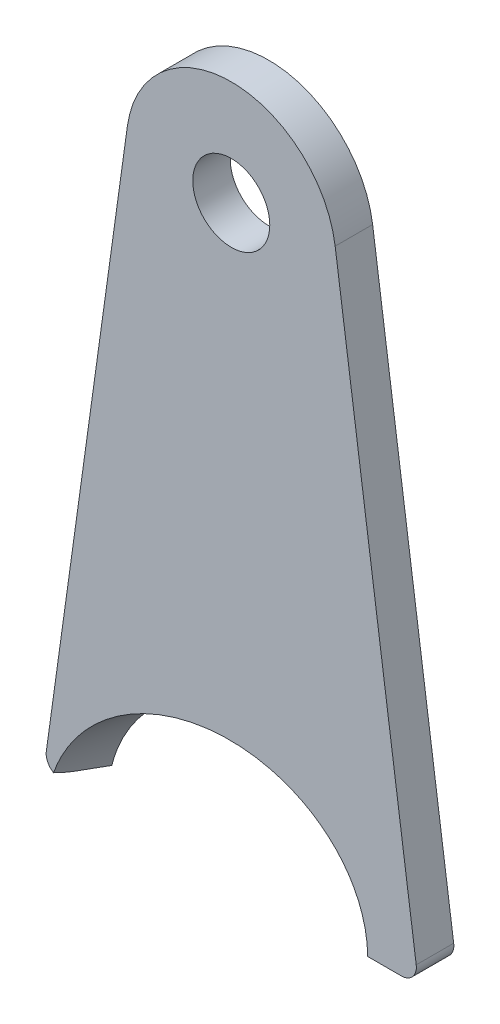
ISO-10303-21;
HEADER;
FILE_DESCRIPTION(('STEP AP214'),'2;1');
FILE_NAME('part.step','',(''),(''),'','','');
FILE_SCHEMA(('AUTOMOTIVE_DESIGN { 1 0 10303 214 1 1 1 1 }'));
ENDSEC;
DATA;
#1=APPLICATION_CONTEXT('core data for automotive mechanical design processes');
#2=APPLICATION_PROTOCOL_DEFINITION('international standard','automotive_design',2000,#1);
#3=PRODUCT_CONTEXT('',#1,'mechanical');
#4=PRODUCT('Part','Part','',(#3));
#5=PRODUCT_RELATED_PRODUCT_CATEGORY('part','',(#4));
#6=PRODUCT_DEFINITION_FORMATION('','',#4);
#7=PRODUCT_DEFINITION_CONTEXT('part definition',#1,'design');
#8=PRODUCT_DEFINITION('design','',#6,#7);
#9=PRODUCT_DEFINITION_SHAPE('','',#8);
#10=(LENGTH_UNIT() NAMED_UNIT(*) SI_UNIT(.MILLI.,.METRE.));
#11=(NAMED_UNIT(*) PLANE_ANGLE_UNIT() SI_UNIT($,.RADIAN.));
#12=(NAMED_UNIT(*) SI_UNIT($,.STERADIAN.) SOLID_ANGLE_UNIT());
#13=UNCERTAINTY_MEASURE_WITH_UNIT(LENGTH_MEASURE(1.E-05),#10,'distance_accuracy_value','');
#14=(GEOMETRIC_REPRESENTATION_CONTEXT(3) GLOBAL_UNCERTAINTY_ASSIGNED_CONTEXT((#13)) GLOBAL_UNIT_ASSIGNED_CONTEXT((#10,
#11,#12)) REPRESENTATION_CONTEXT('',''));
#15=CARTESIAN_POINT('',(0.,0.,0.));
#16=DIRECTION('',(0.,0.,1.));
#17=DIRECTION('',(1.,0.,0.));
#18=AXIS2_PLACEMENT_3D('',#15,#16,#17);
#19=CARTESIAN_POINT('',(0.,-49.53,3.175));
#20=DIRECTION('',(0.,1.,0.));
#21=DIRECTION('',(-1.,0.,0.));
#22=AXIS2_PLACEMENT_3D('',#19,#20,#21);
#23=PLANE('',#22);
#24=DIRECTION('',(1.,0.,0.));
#25=VECTOR('',#24,1.);
#26=CARTESIAN_POINT('',(0.,-49.53,0.));
#27=LINE('',#26,#25);
#28=CARTESIAN_POINT('',(13.6055420477318,-49.53,0.));
#29=VERTEX_POINT('',#28);
#30=CARTESIAN_POINT('',(14.4158368159501,-49.53,0.));
#31=VERTEX_POINT('',#30);
#32=EDGE_CURVE('E229',#29,#31,#27,.T.);
#33=ORIENTED_EDGE('',*,*,#32,.T.);
#34=DIRECTION('',(0.,0.,-1.));
#35=VECTOR('',#34,1.);
#36=CARTESIAN_POINT('',(14.4158368159501,-49.53,3.175));
#37=LINE('',#36,#35);
#38=CARTESIAN_POINT('',(14.4158368159501,-49.53,3.175));
#39=VERTEX_POINT('',#38);
#40=EDGE_CURVE('E289',#31,#39,#37,.F.);
#41=ORIENTED_EDGE('',*,*,#40,.T.);
#42=DIRECTION('',(1.,0.,0.));
#43=VECTOR('',#42,1.);
#44=CARTESIAN_POINT('',(0.,-49.53,3.175));
#45=LINE('',#44,#43);
#46=CARTESIAN_POINT('',(11.5669262911306,-49.53,3.175));
#47=VERTEX_POINT('',#46);
#48=EDGE_CURVE('E272',#47,#39,#45,.T.);
#49=ORIENTED_EDGE('',*,*,#48,.F.);
#50=CARTESIAN_POINT('',(2.29948606295052,-49.53,-3.53926844532571));
#51=DIRECTION('',(0.,1.,0.));
#52=DIRECTION('',(0.544815380436231,0.,-0.838556021527558));
#53=AXIS2_PLACEMENT_3D('',#50,#51,#52);
#54=ELLIPSE('',#53,52.6907155835493,11.43);
#55=EDGE_CURVE('E219',#29,#47,#54,.F.);
#56=ORIENTED_EDGE('',*,*,#55,.F.);
#57=EDGE_LOOP('',(#33,#41,#49,#56));
#58=FACE_BOUND('',#57,.T.);
#59=ADVANCED_FACE('F138',(#58),#23,.F.);
#60=CARTESIAN_POINT('',(-8.80499106591057,1.22647149548415,3.175));
#61=DIRECTION('',(-0.990437690203663,0.137960798142199,0.));
#62=DIRECTION('',(-0.1379607981422,-0.990437690203663,0.));
#63=AXIS2_PLACEMENT_3D('',#60,#61,#62);
#64=PLANE('',#63);
#65=DIRECTION('',(0.1379607981422,0.990437690203663,0.));
#66=VECTOR('',#65,1.);
#67=CARTESIAN_POINT('',(-8.80499106591057,1.22647149548415,0.));
#68=LINE('',#67,#66);
#69=CARTESIAN_POINT('',(-15.6736926825088,-48.0847897863594,0.));
#70=VERTEX_POINT('',#69);
#71=CARTESIAN_POINT('',(-8.80499106591057,1.22647149548415,0.));
#72=VERTEX_POINT('',#71);
#73=EDGE_CURVE('E253',#70,#72,#68,.T.);
#74=ORIENTED_EDGE('',*,*,#73,.F.);
#75=DIRECTION('',(0.,0.,-1.));
#76=VECTOR('',#75,1.);
#77=CARTESIAN_POINT('',(-15.6736926825088,-48.0847897863594,3.175));
#78=LINE('',#77,#76);
#79=CARTESIAN_POINT('',(-15.6736926825088,-48.0847897863594,3.175));
#80=VERTEX_POINT('',#79);
#81=EDGE_CURVE('E153',#70,#80,#78,.F.);
#82=ORIENTED_EDGE('',*,*,#81,.T.);
#83=DIRECTION('',(0.1379607981422,0.990437690203663,0.));
#84=VECTOR('',#83,1.);
#85=CARTESIAN_POINT('',(-8.80499106591057,1.22647149548415,3.175));
#86=LINE('',#85,#84);
#87=CARTESIAN_POINT('',(-8.80499106591057,1.22647149548415,3.175));
#88=VERTEX_POINT('',#87);
#89=EDGE_CURVE('E249',#80,#88,#86,.T.);
#90=ORIENTED_EDGE('',*,*,#89,.T.);
#91=DIRECTION('',(0.,0.,-1.));
#92=VECTOR('',#91,1.);
#93=CARTESIAN_POINT('',(-8.80499106591057,1.22647149548415,3.175));
#94=LINE('',#93,#92);
#95=EDGE_CURVE('E227',#88,#72,#94,.T.);
#96=ORIENTED_EDGE('',*,*,#95,.T.);
#97=EDGE_LOOP('',(#74,#82,#90,#96));
#98=FACE_BOUND('',#97,.T.);
#99=ADVANCED_FACE('F319',(#98),#64,.T.);
#100=CARTESIAN_POINT('',(-14.4158368159501,-49.53,1.9294052807537));
#101=VERTEX_POINT('',#100);
#102=CARTESIAN_POINT('',(-13.3037701648821,-49.53,0.));
#103=VERTEX_POINT('',#102);
#104=EDGE_CURVE('E206',#101,#103,#54,.F.);
#105=ORIENTED_EDGE('',*,*,#104,.F.);
#106=DIRECTION('',(0.,0.,-1.));
#107=VECTOR('',#106,1.);
#108=CARTESIAN_POINT('',(-14.4158368159501,-49.53,0.));
#109=LINE('',#108,#107);
#110=CARTESIAN_POINT('',(-14.4158368159501,-49.53,0.));
#111=VERTEX_POINT('',#110);
#112=EDGE_CURVE('E223',#101,#111,#109,.T.);
#113=ORIENTED_EDGE('',*,*,#112,.T.);
#114=EDGE_CURVE('E221',#111,#103,#27,.T.);
#115=ORIENTED_EDGE('',*,*,#114,.T.);
#116=EDGE_LOOP('',(#105,#113,#115));
#117=FACE_BOUND('',#116,.T.);
#118=ADVANCED_FACE('F222',(#117),#23,.F.);
#119=CARTESIAN_POINT('',(8.80499106591057,1.22647149548416,3.175));
#120=DIRECTION('',(-0.990437690203663,-0.1379607981422,0.));
#121=DIRECTION('',(0.1379607981422,-0.990437690203663,0.));
#122=AXIS2_PLACEMENT_3D('',#119,#120,#121);
#123=PLANE('',#122);
#124=DIRECTION('',(-0.1379607981422,0.990437690203663,0.));
#125=VECTOR('',#124,1.);
#126=CARTESIAN_POINT('',(8.80499106591057,1.22647149548416,3.175));
#127=LINE('',#126,#125);
#128=CARTESIAN_POINT('',(15.6736926825088,-48.0847897863594,3.175));
#129=VERTEX_POINT('',#128);
#130=CARTESIAN_POINT('',(8.80499106591057,1.22647149548416,3.175));
#131=VERTEX_POINT('',#130);
#132=EDGE_CURVE('E269',#129,#131,#127,.T.);
#133=ORIENTED_EDGE('',*,*,#132,.F.);
#134=DIRECTION('',(0.,0.,-1.));
#135=VECTOR('',#134,1.);
#136=CARTESIAN_POINT('',(15.6736926825088,-48.0847897863594,3.175));
#137=LINE('',#136,#135);
#138=CARTESIAN_POINT('',(15.6736926825088,-48.0847897863594,0.));
#139=VERTEX_POINT('',#138);
#140=EDGE_CURVE('E238',#129,#139,#137,.T.);
#141=ORIENTED_EDGE('',*,*,#140,.T.);
#142=DIRECTION('',(-0.1379607981422,0.990437690203663,0.));
#143=VECTOR('',#142,1.);
#144=CARTESIAN_POINT('',(8.80499106591057,1.22647149548416,0.));
#145=LINE('',#144,#143);
#146=CARTESIAN_POINT('',(8.80499106591057,1.22647149548416,0.));
#147=VERTEX_POINT('',#146);
#148=EDGE_CURVE('E226',#139,#147,#145,.T.);
#149=ORIENTED_EDGE('',*,*,#148,.T.);
#150=DIRECTION('',(0.,0.,-1.));
#151=VECTOR('',#150,1.);
#152=CARTESIAN_POINT('',(8.80499106591057,1.22647149548416,3.175));
#153=LINE('',#152,#151);
#154=EDGE_CURVE('E240',#131,#147,#153,.T.);
#155=ORIENTED_EDGE('',*,*,#154,.F.);
#156=EDGE_LOOP('',(#133,#141,#149,#155));
#157=FACE_BOUND('',#156,.T.);
#158=ADVANCED_FACE('F311',(#157),#123,.F.);
#159=CARTESIAN_POINT('',(0.,0.,3.175));
#160=DIRECTION('',(0.,0.,-1.));
#161=DIRECTION('',(-1.,0.,0.));
#162=AXIS2_PLACEMENT_3D('',#159,#160,#161);
#163=CYLINDRICAL_SURFACE('',#162,8.89);
#164=CARTESIAN_POINT('',(0.,0.,0.));
#165=DIRECTION('',(0.,0.,1.));
#166=DIRECTION('',(1.,0.,0.));
#167=AXIS2_PLACEMENT_3D('',#164,#165,#166);
#168=CIRCLE('',#167,8.89);
#169=EDGE_CURVE('E245',#147,#72,#168,.T.);
#170=ORIENTED_EDGE('',*,*,#169,.T.);
#171=ORIENTED_EDGE('',*,*,#95,.F.);
#172=CARTESIAN_POINT('',(0.,0.,3.175));
#173=DIRECTION('',(0.,0.,1.));
#174=DIRECTION('',(1.,0.,0.));
#175=AXIS2_PLACEMENT_3D('',#172,#173,#174);
#176=CIRCLE('',#175,8.89);
#177=EDGE_CURVE('E261',#131,#88,#176,.T.);
#178=ORIENTED_EDGE('',*,*,#177,.F.);
#179=ORIENTED_EDGE('',*,*,#154,.T.);
#180=EDGE_LOOP('',(#170,#171,#178,#179));
#181=FACE_BOUND('',#180,.T.);
#182=ADVANCED_FACE('F322',(#181),#163,.T.);
#183=CARTESIAN_POINT('',(0.,0.,3.175));
#184=DIRECTION('',(0.,0.,-1.));
#185=DIRECTION('',(-1.,0.,0.));
#186=AXIS2_PLACEMENT_3D('',#183,#184,#185);
#187=CYLINDRICAL_SURFACE('',#186,3.2639);
#188=CARTESIAN_POINT('',(0.,0.,3.175));
#189=DIRECTION('',(0.,0.,1.));
#190=DIRECTION('',(1.,0.,0.));
#191=AXIS2_PLACEMENT_3D('',#188,#189,#190);
#192=CIRCLE('',#191,3.2639);
#193=CARTESIAN_POINT('',(3.2639,0.,3.175));
#194=VERTEX_POINT('',#193);
#195=EDGE_CURVE('E244',#194,#194,#192,.T.);
#196=ORIENTED_EDGE('',*,*,#195,.T.);
#197=EDGE_LOOP('',(#196));
#198=FACE_BOUND('',#197,.T.);
#199=CARTESIAN_POINT('',(0.,0.,0.));
#200=DIRECTION('',(0.,0.,1.));
#201=DIRECTION('',(1.,0.,0.));
#202=AXIS2_PLACEMENT_3D('',#199,#200,#201);
#203=CIRCLE('',#202,3.2639);
#204=CARTESIAN_POINT('',(3.2639,0.,0.));
#205=VERTEX_POINT('',#204);
#206=EDGE_CURVE('E217',#205,#205,#203,.T.);
#207=ORIENTED_EDGE('',*,*,#206,.F.);
#208=EDGE_LOOP('',(#207));
#209=FACE_BOUND('',#208,.T.);
#210=ADVANCED_FACE('F324',(#198,#209),#187,.F.);
#211=CARTESIAN_POINT('',(0.,0.,3.175));
#212=DIRECTION('',(0.,0.,1.));
#213=DIRECTION('',(1.,0.,0.));
#214=AXIS2_PLACEMENT_3D('',#211,#212,#213);
#215=PLANE('',#214);
#216=ORIENTED_EDGE('',*,*,#48,.T.);
#217=CARTESIAN_POINT('',(14.4158368159501,-48.26,3.175));
#218=DIRECTION('',(0.,0.,1.));
#219=DIRECTION('',(1.,0.,0.));
#220=AXIS2_PLACEMENT_3D('',#217,#218,#219);
#221=CIRCLE('',#220,1.27);
#222=EDGE_CURVE('E295',#39,#129,#221,.T.);
#223=ORIENTED_EDGE('',*,*,#222,.T.);
#224=ORIENTED_EDGE('',*,*,#132,.T.);
#225=ORIENTED_EDGE('',*,*,#177,.T.);
#226=ORIENTED_EDGE('',*,*,#89,.F.);
#227=CARTESIAN_POINT('',(-14.4158368159501,-48.26,3.175));
#228=DIRECTION('',(0.,0.,1.));
#229=DIRECTION('',(1.,0.,0.));
#230=AXIS2_PLACEMENT_3D('',#227,#228,#229);
#231=CIRCLE('',#230,1.27);
#232=CARTESIAN_POINT('',(-15.0598471280133,-49.3546007116552,3.17500000000001));
#233=VERTEX_POINT('',#232);
#234=EDGE_CURVE('E292',#80,#233,#231,.T.);
#235=ORIENTED_EDGE('',*,*,#234,.T.);
#236=CARTESIAN_POINT('',(-2.06281845038114,-51.30928407364,3.17500000000001));
#237=DIRECTION('',(0.,0.,1.));
#238=DIRECTION('',(0.925940325935367,0.377669846303231,0.));
#239=AXIS2_PLACEMENT_3D('',#236,#237,#238);
#240=ELLIPSE('',#239,13.9630626672029,11.43);
#241=EDGE_CURVE('E265',#233,#47,#240,.F.);
#242=ORIENTED_EDGE('',*,*,#241,.T.);
#243=EDGE_LOOP('',(#216,#223,#224,#225,#226,#235,#242));
#244=FACE_BOUND('',#243,.T.);
#245=ORIENTED_EDGE('',*,*,#195,.F.);
#246=EDGE_LOOP('',(#245));
#247=FACE_BOUND('',#246,.T.);
#248=ADVANCED_FACE('F303',(#244,#247),#215,.T.);
#249=CARTESIAN_POINT('',(0.,0.,0.));
#250=DIRECTION('',(0.,0.,1.));
#251=DIRECTION('',(1.,0.,0.));
#252=AXIS2_PLACEMENT_3D('',#249,#250,#251);
#253=PLANE('',#252);
#254=ORIENTED_EDGE('',*,*,#148,.F.);
#255=CARTESIAN_POINT('',(14.4158368159501,-48.26,0.));
#256=DIRECTION('',(0.,0.,1.));
#257=DIRECTION('',(1.,0.,0.));
#258=AXIS2_PLACEMENT_3D('',#255,#256,#257);
#259=CIRCLE('',#258,1.27);
#260=EDGE_CURVE('E286',#139,#31,#259,.F.);
#261=ORIENTED_EDGE('',*,*,#260,.T.);
#262=ORIENTED_EDGE('',*,*,#32,.F.);
#263=CARTESIAN_POINT('',(-2.4980018054066E-13,-50.4679076854588,0.));
#264=DIRECTION('',(0.,0.,1.));
#265=DIRECTION('',(0.925940325935367,0.377669846303231,0.));
#266=AXIS2_PLACEMENT_3D('',#263,#264,#265);
#267=ELLIPSE('',#266,13.9630626672029,11.43);
#268=EDGE_CURVE('E211',#103,#29,#267,.F.);
#269=ORIENTED_EDGE('',*,*,#268,.F.);
#270=ORIENTED_EDGE('',*,*,#114,.F.);
#271=CARTESIAN_POINT('',(-14.4158368159501,-48.26,0.));
#272=DIRECTION('',(0.,0.,1.));
#273=DIRECTION('',(1.,0.,0.));
#274=AXIS2_PLACEMENT_3D('',#271,#272,#273);
#275=CIRCLE('',#274,1.27);
#276=EDGE_CURVE('E283',#111,#70,#275,.F.);
#277=ORIENTED_EDGE('',*,*,#276,.T.);
#278=ORIENTED_EDGE('',*,*,#73,.T.);
#279=ORIENTED_EDGE('',*,*,#169,.F.);
#280=EDGE_LOOP('',(#254,#261,#262,#269,#270,#277,#278,#279));
#281=FACE_BOUND('',#280,.T.);
#282=ORIENTED_EDGE('',*,*,#206,.T.);
#283=EDGE_LOOP('',(#282));
#284=FACE_BOUND('',#283,.T.);
#285=ADVANCED_FACE('F232',(#281,#284),#253,.F.);
#286=CARTESIAN_POINT('',(-123.025911317866,-100.647358474361,189.356105653458));
#287=DIRECTION('',(0.531842232493453,0.216926262500193,-0.818588319226507));
#288=DIRECTION('',(0.455152304592376,0.74192435650579,0.492325734496702));
#289=AXIS2_PLACEMENT_3D('',#286,#287,#288);
#290=CYLINDRICAL_SURFACE('',#289,11.43);
#291=ORIENTED_EDGE('',*,*,#241,.F.);
#292=CARTESIAN_POINT('',(-15.0598471280133,-49.3546007116552,3.17500000000001));
#293=CARTESIAN_POINT('',(-15.011751232782,-49.3828704559459,3.07066717364433));
#294=CARTESIAN_POINT('',(-14.9619924930283,-49.4079089872784,2.96622390889633));
#295=CARTESIAN_POINT('',(-14.8597255163493,-49.451195983653,2.7578139670671));
#296=CARTESIAN_POINT('',(-14.8072290842269,-49.4694712306903,2.65384705594593));
#297=CARTESIAN_POINT('',(-14.699668339783,-49.4991350731171,2.44624068054313));
#298=CARTESIAN_POINT('',(-14.644603860096,-49.5105232189811,2.3426012380747));
#299=CARTESIAN_POINT('',(-14.5319769515245,-49.5259502835407,2.13559811087226));
#300=CARTESIAN_POINT('',(-14.4744053676457,-49.5299594630732,2.03223721121362));
#301=CARTESIAN_POINT('',(-14.4158368159502,-49.5300000000001,1.9294052807537));
#302=B_SPLINE_CURVE_WITH_KNOTS('',3,(#292,#293,#294,#295,#296,#297,#298,#299,#300,#301),
.UNSPECIFIED.,.F.,.F.,(4,2,2,2,4),(0.,0.354880722644016,0.708340718947964,1.06182378332537,
1.41672838324488),.UNSPECIFIED.);
#303=EDGE_CURVE('E12',#233,#101,#302,.T.);
#304=ORIENTED_EDGE('',*,*,#303,.T.);
#305=ORIENTED_EDGE('',*,*,#104,.T.);
#306=ORIENTED_EDGE('',*,*,#268,.T.);
#307=ORIENTED_EDGE('',*,*,#55,.T.);
#308=EDGE_LOOP('',(#291,#304,#305,#306,#307));
#309=FACE_BOUND('',#308,.T.);
#310=ADVANCED_FACE('F208',(#309),#290,.F.);
#311=CARTESIAN_POINT('',(14.4158368159501,-48.26,3.175));
#312=DIRECTION('',(0.,0.,-1.));
#313=DIRECTION('',(-1.,0.,0.));
#314=AXIS2_PLACEMENT_3D('',#311,#312,#313);
#315=CYLINDRICAL_SURFACE('',#314,1.27);
#316=ORIENTED_EDGE('',*,*,#222,.F.);
#317=ORIENTED_EDGE('',*,*,#40,.F.);
#318=ORIENTED_EDGE('',*,*,#260,.F.);
#319=ORIENTED_EDGE('',*,*,#140,.F.);
#320=EDGE_LOOP('',(#316,#317,#318,#319));
#321=FACE_BOUND('',#320,.T.);
#322=ADVANCED_FACE('F313',(#321),#315,.T.);
#323=CARTESIAN_POINT('',(-14.4158368159501,-48.26,3.175));
#324=DIRECTION('',(0.,0.,1.));
#325=DIRECTION('',(1.,0.,0.));
#326=AXIS2_PLACEMENT_3D('',#323,#324,#325);
#327=CYLINDRICAL_SURFACE('',#326,1.27);
#328=ORIENTED_EDGE('',*,*,#234,.F.);
#329=ORIENTED_EDGE('',*,*,#81,.F.);
#330=ORIENTED_EDGE('',*,*,#276,.F.);
#331=ORIENTED_EDGE('',*,*,#112,.F.);
#332=ORIENTED_EDGE('',*,*,#303,.F.);
#333=EDGE_LOOP('',(#328,#329,#330,#331,#332));
#334=FACE_BOUND('',#333,.T.);
#335=ADVANCED_FACE('F140',(#334),#327,.T.);
#336=CLOSED_SHELL('',(#59,#99,#118,#158,#182,#210,#248,#285,#310,#322,#335));
#337=MANIFOLD_SOLID_BREP('B2',#336);
#338=ADVANCED_BREP_SHAPE_REPRESENTATION('',(#18,#337),#14);
#339=SHAPE_DEFINITION_REPRESENTATION(#9,#338);
ENDSEC;
END-ISO-10303-21;
